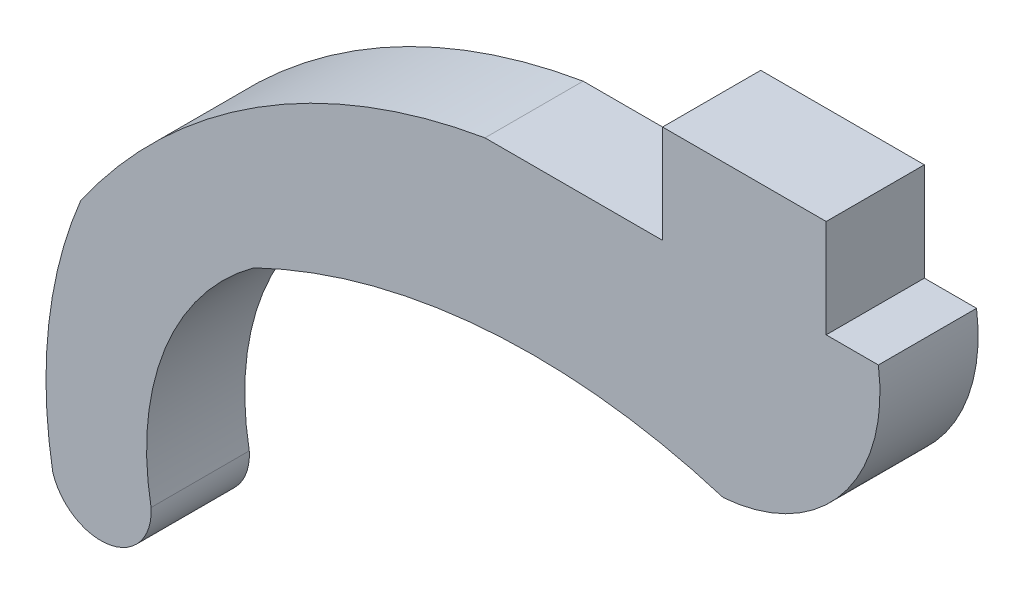
ISO-10303-21;
HEADER;
FILE_DESCRIPTION(('STEP AP214'),'2;1');
FILE_NAME('part.step','',(''),(''),'','','');
FILE_SCHEMA(('AUTOMOTIVE_DESIGN { 1 0 10303 214 1 1 1 1 }'));
ENDSEC;
DATA;
#1=APPLICATION_CONTEXT('core data for automotive mechanical design processes');
#2=APPLICATION_PROTOCOL_DEFINITION('international standard','automotive_design',2000,#1);
#3=PRODUCT_CONTEXT('',#1,'mechanical');
#4=PRODUCT('Part','Part','',(#3));
#5=PRODUCT_RELATED_PRODUCT_CATEGORY('part','',(#4));
#6=PRODUCT_DEFINITION_FORMATION('','',#4);
#7=PRODUCT_DEFINITION_CONTEXT('part definition',#1,'design');
#8=PRODUCT_DEFINITION('design','',#6,#7);
#9=PRODUCT_DEFINITION_SHAPE('','',#8);
#10=(LENGTH_UNIT() NAMED_UNIT(*) SI_UNIT(.MILLI.,.METRE.));
#11=(NAMED_UNIT(*) PLANE_ANGLE_UNIT() SI_UNIT($,.RADIAN.));
#12=(NAMED_UNIT(*) SI_UNIT($,.STERADIAN.) SOLID_ANGLE_UNIT());
#13=UNCERTAINTY_MEASURE_WITH_UNIT(LENGTH_MEASURE(1.E-05),#10,'distance_accuracy_value','');
#14=(GEOMETRIC_REPRESENTATION_CONTEXT(3) GLOBAL_UNCERTAINTY_ASSIGNED_CONTEXT((#13)) GLOBAL_UNIT_ASSIGNED_CONTEXT((#10,
#11,#12)) REPRESENTATION_CONTEXT('',''));
#15=CARTESIAN_POINT('',(0.,0.,0.));
#16=DIRECTION('',(0.,0.,1.));
#17=DIRECTION('',(1.,0.,0.));
#18=AXIS2_PLACEMENT_3D('',#15,#16,#17);
#19=CARTESIAN_POINT('',(-111.845658384387,0.,1.524));
#20=DIRECTION('',(0.,-1.,0.));
#21=DIRECTION('',(0.,0.,-1.));
#22=AXIS2_PLACEMENT_3D('',#19,#20,#21);
#23=PLANE('',#22);
#24=DIRECTION('',(-1.,0.,0.));
#25=VECTOR('',#24,1.);
#26=CARTESIAN_POINT('',(-111.845658384387,0.,0.));
#27=LINE('',#26,#25);
#28=CARTESIAN_POINT('',(-109.305658384387,0.,0.));
#29=VERTEX_POINT('',#28);
#30=CARTESIAN_POINT('',(-111.845658384387,0.,0.));
#31=VERTEX_POINT('',#30);
#32=EDGE_CURVE('E150',#29,#31,#27,.T.);
#33=ORIENTED_EDGE('',*,*,#32,.T.);
#34=DIRECTION('',(0.,0.,-1.));
#35=VECTOR('',#34,1.);
#36=CARTESIAN_POINT('',(-111.845658384387,0.,1.524));
#37=LINE('',#36,#35);
#38=CARTESIAN_POINT('',(-111.845658384387,0.,1.524));
#39=VERTEX_POINT('',#38);
#40=EDGE_CURVE('E11',#39,#31,#37,.T.);
#41=ORIENTED_EDGE('',*,*,#40,.F.);
#42=DIRECTION('',(-1.,0.,0.));
#43=VECTOR('',#42,1.);
#44=CARTESIAN_POINT('',(-111.845658384387,0.,1.524));
#45=LINE('',#44,#43);
#46=CARTESIAN_POINT('',(-109.305658384387,0.,1.524));
#47=VERTEX_POINT('',#46);
#48=EDGE_CURVE('E170',#47,#39,#45,.T.);
#49=ORIENTED_EDGE('',*,*,#48,.F.);
#50=DIRECTION('',(0.,0.,-1.));
#51=VECTOR('',#50,1.);
#52=CARTESIAN_POINT('',(-109.305658384387,0.,1.524));
#53=LINE('',#52,#51);
#54=EDGE_CURVE('E146',#47,#29,#53,.T.);
#55=ORIENTED_EDGE('',*,*,#54,.T.);
#56=EDGE_LOOP('',(#33,#41,#49,#55));
#57=FACE_BOUND('',#56,.T.);
#58=ADVANCED_FACE('F36',(#57),#23,.F.);
#59=CARTESIAN_POINT('',(-111.845658384387,0.,1.524));
#60=DIRECTION('',(1.,0.,0.));
#61=DIRECTION('',(0.,0.,-1.));
#62=AXIS2_PLACEMENT_3D('',#59,#60,#61);
#63=PLANE('',#62);
#64=DIRECTION('',(0.,-1.,0.));
#65=VECTOR('',#64,1.);
#66=CARTESIAN_POINT('',(-111.845658384387,0.,0.));
#67=LINE('',#66,#65);
#68=CARTESIAN_POINT('',(-111.845658384387,-1.524,0.));
#69=VERTEX_POINT('',#68);
#70=EDGE_CURVE('E153',#31,#69,#67,.T.);
#71=ORIENTED_EDGE('',*,*,#70,.T.);
#72=DIRECTION('',(0.,0.,-1.));
#73=VECTOR('',#72,1.);
#74=CARTESIAN_POINT('',(-111.845658384387,-1.524,1.524));
#75=LINE('',#74,#73);
#76=CARTESIAN_POINT('',(-111.845658384387,-1.524,1.524));
#77=VERTEX_POINT('',#76);
#78=EDGE_CURVE('E44',#77,#69,#75,.T.);
#79=ORIENTED_EDGE('',*,*,#78,.F.);
#80=DIRECTION('',(0.,-1.,0.));
#81=VECTOR('',#80,1.);
#82=CARTESIAN_POINT('',(-111.845658384387,0.,1.524));
#83=LINE('',#82,#81);
#84=EDGE_CURVE('E104',#39,#77,#83,.T.);
#85=ORIENTED_EDGE('',*,*,#84,.F.);
#86=ORIENTED_EDGE('',*,*,#40,.T.);
#87=EDGE_LOOP('',(#71,#79,#85,#86));
#88=FACE_BOUND('',#87,.T.);
#89=ADVANCED_FACE('F242',(#88),#63,.F.);
#90=CARTESIAN_POINT('',(-111.845658384387,-1.524,1.524));
#91=DIRECTION('',(0.,-1.,0.));
#92=DIRECTION('',(0.,0.,-1.));
#93=AXIS2_PLACEMENT_3D('',#90,#91,#92);
#94=PLANE('',#93);
#95=DIRECTION('',(-1.,0.,0.));
#96=VECTOR('',#95,1.);
#97=CARTESIAN_POINT('',(-111.845658384387,-1.524,0.));
#98=LINE('',#97,#96);
#99=CARTESIAN_POINT('',(-114.602460127081,-1.524,0.));
#100=VERTEX_POINT('',#99);
#101=EDGE_CURVE('E155',#69,#100,#98,.T.);
#102=ORIENTED_EDGE('',*,*,#101,.T.);
#103=DIRECTION('',(0.,0.,-1.));
#104=VECTOR('',#103,1.);
#105=CARTESIAN_POINT('',(-114.602460127081,-1.524,1.524));
#106=LINE('',#105,#104);
#107=CARTESIAN_POINT('',(-114.602460127081,-1.524,1.524));
#108=VERTEX_POINT('',#107);
#109=EDGE_CURVE('E186',#108,#100,#106,.T.);
#110=ORIENTED_EDGE('',*,*,#109,.F.);
#111=DIRECTION('',(-1.,0.,0.));
#112=VECTOR('',#111,1.);
#113=CARTESIAN_POINT('',(-111.845658384387,-1.524,1.524));
#114=LINE('',#113,#112);
#115=EDGE_CURVE('E194',#77,#108,#114,.T.);
#116=ORIENTED_EDGE('',*,*,#115,.F.);
#117=ORIENTED_EDGE('',*,*,#78,.T.);
#118=EDGE_LOOP('',(#102,#110,#116,#117));
#119=FACE_BOUND('',#118,.T.);
#120=ADVANCED_FACE('F192',(#119),#94,.F.);
#121=CARTESIAN_POINT('',(-112.996762013157,-10.990349581431,1.524));
#122=DIRECTION('',(0.,0.,-1.));
#123=DIRECTION('',(-1.,0.,0.));
#124=AXIS2_PLACEMENT_3D('',#121,#122,#123);
#125=CYLINDRICAL_SURFACE('',#124,9.60156449912805);
#126=CARTESIAN_POINT('',(-112.996762013157,-10.990349581431,0.));
#127=DIRECTION('',(0.,0.,1.));
#128=DIRECTION('',(1.,0.,0.));
#129=AXIS2_PLACEMENT_3D('',#126,#127,#128);
#130=CIRCLE('',#129,9.60156449912805);
#131=CARTESIAN_POINT('',(-120.878346421559,-5.50667672064264,0.));
#132=VERTEX_POINT('',#131);
#133=EDGE_CURVE('E157',#100,#132,#130,.T.);
#134=ORIENTED_EDGE('',*,*,#133,.T.);
#135=DIRECTION('',(0.,0.,-1.));
#136=VECTOR('',#135,1.);
#137=CARTESIAN_POINT('',(-120.878346421559,-5.50667672064264,1.524));
#138=LINE('',#137,#136);
#139=CARTESIAN_POINT('',(-120.878346421559,-5.50667672064264,1.524));
#140=VERTEX_POINT('',#139);
#141=EDGE_CURVE('E183',#140,#132,#138,.T.);
#142=ORIENTED_EDGE('',*,*,#141,.F.);
#143=CARTESIAN_POINT('',(-112.996762013157,-10.990349581431,1.524));
#144=DIRECTION('',(0.,0.,1.));
#145=DIRECTION('',(1.,0.,0.));
#146=AXIS2_PLACEMENT_3D('',#143,#144,#145);
#147=CIRCLE('',#146,9.60156449912805);
#148=EDGE_CURVE('E212',#108,#140,#147,.T.);
#149=ORIENTED_EDGE('',*,*,#148,.F.);
#150=ORIENTED_EDGE('',*,*,#109,.T.);
#151=EDGE_LOOP('',(#134,#142,#149,#150));
#152=FACE_BOUND('',#151,.T.);
#153=ADVANCED_FACE('F203',(#152),#125,.T.);
#154=CARTESIAN_POINT('',(-114.523744723031,-8.17618633381467,1.524));
#155=DIRECTION('',(0.,0.,-1.));
#156=DIRECTION('',(-1.,0.,0.));
#157=AXIS2_PLACEMENT_3D('',#154,#155,#156);
#158=CYLINDRICAL_SURFACE('',#157,6.89254991434649);
#159=CARTESIAN_POINT('',(-114.523744723031,-8.17618633381467,0.));
#160=DIRECTION('',(0.,0.,1.));
#161=DIRECTION('',(1.,0.,0.));
#162=AXIS2_PLACEMENT_3D('',#159,#160,#161);
#163=CIRCLE('',#162,6.89254991434649);
#164=CARTESIAN_POINT('',(-121.311747708148,-9.37212102926943,0.));
#165=VERTEX_POINT('',#164);
#166=EDGE_CURVE('E159',#132,#165,#163,.T.);
#167=ORIENTED_EDGE('',*,*,#166,.T.);
#168=DIRECTION('',(0.,0.,-1.));
#169=VECTOR('',#168,1.);
#170=CARTESIAN_POINT('',(-121.311747708148,-9.37212102926943,1.524));
#171=LINE('',#170,#169);
#172=CARTESIAN_POINT('',(-121.311747708148,-9.37212102926943,1.524));
#173=VERTEX_POINT('',#172);
#174=EDGE_CURVE('E180',#173,#165,#171,.T.);
#175=ORIENTED_EDGE('',*,*,#174,.F.);
#176=CARTESIAN_POINT('',(-114.523744723031,-8.17618633381467,1.524));
#177=DIRECTION('',(0.,0.,1.));
#178=DIRECTION('',(1.,0.,0.));
#179=AXIS2_PLACEMENT_3D('',#176,#177,#178);
#180=CIRCLE('',#179,6.89254991434649);
#181=EDGE_CURVE('E209',#140,#173,#180,.T.);
#182=ORIENTED_EDGE('',*,*,#181,.F.);
#183=ORIENTED_EDGE('',*,*,#141,.T.);
#184=EDGE_LOOP('',(#167,#175,#182,#183));
#185=FACE_BOUND('',#184,.T.);
#186=ADVANCED_FACE('F207',(#185),#158,.T.);
#187=CARTESIAN_POINT('',(-120.565381788024,-9.13873196802296,1.524));
#188=DIRECTION('',(0.,0.,-1.));
#189=DIRECTION('',(-1.,0.,0.));
#190=AXIS2_PLACEMENT_3D('',#187,#188,#189);
#191=CYLINDRICAL_SURFACE('',#190,0.782005460743449);
#192=CARTESIAN_POINT('',(-120.565381788024,-9.13873196802296,0.));
#193=DIRECTION('',(0.,0.,1.));
#194=DIRECTION('',(-1.,0.,0.));
#195=AXIS2_PLACEMENT_3D('',#192,#193,#194);
#196=CIRCLE('',#195,0.782005460743449);
#197=CARTESIAN_POINT('',(-119.785228435081,-9.08494268912818,0.));
#198=VERTEX_POINT('',#197);
#199=EDGE_CURVE('E161',#165,#198,#196,.T.);
#200=ORIENTED_EDGE('',*,*,#199,.T.);
#201=DIRECTION('',(0.,0.,-1.));
#202=VECTOR('',#201,1.);
#203=CARTESIAN_POINT('',(-119.785228435081,-9.08494268912818,1.524));
#204=LINE('',#203,#202);
#205=CARTESIAN_POINT('',(-119.785228435081,-9.08494268912818,1.524));
#206=VERTEX_POINT('',#205);
#207=EDGE_CURVE('E177',#206,#198,#204,.T.);
#208=ORIENTED_EDGE('',*,*,#207,.F.);
#209=CARTESIAN_POINT('',(-120.565381788024,-9.13873196802296,1.524));
#210=DIRECTION('',(0.,0.,1.));
#211=DIRECTION('',(-1.,0.,0.));
#212=AXIS2_PLACEMENT_3D('',#209,#210,#211);
#213=CIRCLE('',#212,0.782005460743449);
#214=EDGE_CURVE('E211',#173,#206,#213,.T.);
#215=ORIENTED_EDGE('',*,*,#214,.F.);
#216=ORIENTED_EDGE('',*,*,#174,.T.);
#217=EDGE_LOOP('',(#200,#208,#215,#216));
#218=FACE_BOUND('',#217,.T.);
#219=ADVANCED_FACE('F255',(#218),#191,.T.);
#220=CARTESIAN_POINT('',(-115.806880780708,-8.33651108001276,1.524));
#221=DIRECTION('',(0.,0.,-1.));
#222=DIRECTION('',(-1.,0.,0.));
#223=AXIS2_PLACEMENT_3D('',#220,#221,#222);
#224=CYLINDRICAL_SURFACE('',#223,4.04813536490303);
#225=CARTESIAN_POINT('',(-115.806880780708,-8.33651108001276,0.));
#226=DIRECTION('',(0.,0.,-1.));
#227=DIRECTION('',(1.,0.,0.));
#228=AXIS2_PLACEMENT_3D('',#225,#226,#227);
#229=CIRCLE('',#228,4.04813536490303);
#230=CARTESIAN_POINT('',(-118.193770427078,-5.06693041139041,0.));
#231=VERTEX_POINT('',#230);
#232=EDGE_CURVE('E163',#198,#231,#229,.T.);
#233=ORIENTED_EDGE('',*,*,#232,.T.);
#234=DIRECTION('',(0.,0.,-1.));
#235=VECTOR('',#234,1.);
#236=CARTESIAN_POINT('',(-118.193770427078,-5.06693041139041,1.524));
#237=LINE('',#236,#235);
#238=CARTESIAN_POINT('',(-118.193770427078,-5.06693041139041,1.524));
#239=VERTEX_POINT('',#238);
#240=EDGE_CURVE('E174',#239,#231,#237,.T.);
#241=ORIENTED_EDGE('',*,*,#240,.F.);
#242=CARTESIAN_POINT('',(-115.806880780708,-8.33651108001276,1.524));
#243=DIRECTION('',(0.,0.,-1.));
#244=DIRECTION('',(1.,0.,0.));
#245=AXIS2_PLACEMENT_3D('',#242,#243,#244);
#246=CIRCLE('',#245,4.04813536490303);
#247=EDGE_CURVE('E214',#206,#239,#246,.T.);
#248=ORIENTED_EDGE('',*,*,#247,.F.);
#249=ORIENTED_EDGE('',*,*,#207,.T.);
#250=EDGE_LOOP('',(#233,#241,#248,#249));
#251=FACE_BOUND('',#250,.T.);
#252=ADVANCED_FACE('F223',(#251),#224,.F.);
#253=CARTESIAN_POINT('',(-113.844867219783,-14.027213762315,1.524));
#254=DIRECTION('',(0.,0.,-1.));
#255=DIRECTION('',(-1.,0.,0.));
#256=AXIS2_PLACEMENT_3D('',#253,#254,#255);
#257=CYLINDRICAL_SURFACE('',#256,9.95990144706653);
#258=CARTESIAN_POINT('',(-113.844867219783,-14.027213762315,0.));
#259=DIRECTION('',(0.,0.,-1.));
#260=DIRECTION('',(1.,0.,0.));
#261=AXIS2_PLACEMENT_3D('',#258,#259,#260);
#262=CIRCLE('',#261,9.95990144706653);
#263=CARTESIAN_POINT('',(-110.905453840669,-4.51093897530086,0.));
#264=VERTEX_POINT('',#263);
#265=EDGE_CURVE('E165',#231,#264,#262,.T.);
#266=ORIENTED_EDGE('',*,*,#265,.T.);
#267=DIRECTION('',(0.,0.,-1.));
#268=VECTOR('',#267,1.);
#269=CARTESIAN_POINT('',(-110.905453840669,-4.51093897530086,1.524));
#270=LINE('',#269,#268);
#271=CARTESIAN_POINT('',(-110.905453840669,-4.51093897530086,1.524));
#272=VERTEX_POINT('',#271);
#273=EDGE_CURVE('E141',#272,#264,#270,.T.);
#274=ORIENTED_EDGE('',*,*,#273,.F.);
#275=CARTESIAN_POINT('',(-113.844867219783,-14.027213762315,1.524));
#276=DIRECTION('',(0.,0.,-1.));
#277=DIRECTION('',(1.,0.,0.));
#278=AXIS2_PLACEMENT_3D('',#275,#276,#277);
#279=CIRCLE('',#278,9.95990144706653);
#280=EDGE_CURVE('E132',#239,#272,#279,.T.);
#281=ORIENTED_EDGE('',*,*,#280,.F.);
#282=ORIENTED_EDGE('',*,*,#240,.T.);
#283=EDGE_LOOP('',(#266,#274,#281,#282));
#284=FACE_BOUND('',#283,.T.);
#285=ADVANCED_FACE('F227',(#284),#257,.F.);
#286=CARTESIAN_POINT('',(-111.105880361588,-1.88361085124618,1.524));
#287=DIRECTION('',(0.,0.,-1.));
#288=DIRECTION('',(-1.,0.,0.));
#289=AXIS2_PLACEMENT_3D('',#286,#287,#288);
#290=CYLINDRICAL_SURFACE('',#289,2.63496183307016);
#291=CARTESIAN_POINT('',(-111.105880361588,-1.88361085124618,0.));
#292=DIRECTION('',(0.,0.,1.));
#293=DIRECTION('',(-1.,0.,0.));
#294=AXIS2_PLACEMENT_3D('',#291,#292,#293);
#295=CIRCLE('',#294,2.63496183307016);
#296=CARTESIAN_POINT('',(-108.495573119633,-1.524,0.));
#297=VERTEX_POINT('',#296);
#298=EDGE_CURVE('E140',#264,#297,#295,.T.);
#299=ORIENTED_EDGE('',*,*,#298,.T.);
#300=DIRECTION('',(0.,0.,-1.));
#301=VECTOR('',#300,1.);
#302=CARTESIAN_POINT('',(-108.495573119633,-1.524,1.524));
#303=LINE('',#302,#301);
#304=CARTESIAN_POINT('',(-108.495573119633,-1.524,1.524));
#305=VERTEX_POINT('',#304);
#306=EDGE_CURVE('E137',#305,#297,#303,.T.);
#307=ORIENTED_EDGE('',*,*,#306,.F.);
#308=CARTESIAN_POINT('',(-111.105880361588,-1.88361085124618,1.524));
#309=DIRECTION('',(0.,0.,1.));
#310=DIRECTION('',(-1.,0.,0.));
#311=AXIS2_PLACEMENT_3D('',#308,#309,#310);
#312=CIRCLE('',#311,2.63496183307016);
#313=EDGE_CURVE('E126',#272,#305,#312,.T.);
#314=ORIENTED_EDGE('',*,*,#313,.F.);
#315=ORIENTED_EDGE('',*,*,#273,.T.);
#316=EDGE_LOOP('',(#299,#307,#314,#315));
#317=FACE_BOUND('',#316,.T.);
#318=ADVANCED_FACE('F138',(#317),#290,.T.);
#319=CARTESIAN_POINT('',(-109.305658384387,-1.524,1.524));
#320=DIRECTION('',(0.,-1.,0.));
#321=DIRECTION('',(0.,0.,-1.));
#322=AXIS2_PLACEMENT_3D('',#319,#320,#321);
#323=PLANE('',#322);
#324=DIRECTION('',(-1.,0.,0.));
#325=VECTOR('',#324,1.);
#326=CARTESIAN_POINT('',(-109.305658384387,-1.524,0.));
#327=LINE('',#326,#325);
#328=CARTESIAN_POINT('',(-109.305658384387,-1.524,0.));
#329=VERTEX_POINT('',#328);
#330=EDGE_CURVE('E90',#297,#329,#327,.T.);
#331=ORIENTED_EDGE('',*,*,#330,.T.);
#332=DIRECTION('',(0.,0.,-1.));
#333=VECTOR('',#332,1.);
#334=CARTESIAN_POINT('',(-109.305658384387,-1.524,1.524));
#335=LINE('',#334,#333);
#336=CARTESIAN_POINT('',(-109.305658384387,-1.524,1.524));
#337=VERTEX_POINT('',#336);
#338=EDGE_CURVE('E142',#337,#329,#335,.T.);
#339=ORIENTED_EDGE('',*,*,#338,.F.);
#340=DIRECTION('',(-1.,0.,0.));
#341=VECTOR('',#340,1.);
#342=CARTESIAN_POINT('',(-109.305658384387,-1.524,1.524));
#343=LINE('',#342,#341);
#344=EDGE_CURVE('E130',#305,#337,#343,.T.);
#345=ORIENTED_EDGE('',*,*,#344,.F.);
#346=ORIENTED_EDGE('',*,*,#306,.T.);
#347=EDGE_LOOP('',(#331,#339,#345,#346));
#348=FACE_BOUND('',#347,.T.);
#349=ADVANCED_FACE('F144',(#348),#323,.F.);
#350=CARTESIAN_POINT('',(-109.305658384387,0.,1.524));
#351=DIRECTION('',(-1.,0.,0.));
#352=DIRECTION('',(0.,0.,1.));
#353=AXIS2_PLACEMENT_3D('',#350,#351,#352);
#354=PLANE('',#353);
#355=DIRECTION('',(0.,1.,0.));
#356=VECTOR('',#355,1.);
#357=CARTESIAN_POINT('',(-109.305658384387,0.,0.));
#358=LINE('',#357,#356);
#359=EDGE_CURVE('E96',#329,#29,#358,.T.);
#360=ORIENTED_EDGE('',*,*,#359,.T.);
#361=ORIENTED_EDGE('',*,*,#54,.F.);
#362=DIRECTION('',(0.,1.,0.));
#363=VECTOR('',#362,1.);
#364=CARTESIAN_POINT('',(-109.305658384387,0.,1.524));
#365=LINE('',#364,#363);
#366=EDGE_CURVE('E52',#337,#47,#365,.T.);
#367=ORIENTED_EDGE('',*,*,#366,.F.);
#368=ORIENTED_EDGE('',*,*,#338,.T.);
#369=EDGE_LOOP('',(#360,#361,#367,#368));
#370=FACE_BOUND('',#369,.T.);
#371=ADVANCED_FACE('F231',(#370),#354,.F.);
#372=CARTESIAN_POINT('',(-111.105880361588,-1.88361085124618,1.524));
#373=DIRECTION('',(0.,0.,-1.));
#374=DIRECTION('',(-1.,0.,0.));
#375=AXIS2_PLACEMENT_3D('',#372,#373,#374);
#376=PLANE('',#375);
#377=ORIENTED_EDGE('',*,*,#48,.T.);
#378=ORIENTED_EDGE('',*,*,#84,.T.);
#379=ORIENTED_EDGE('',*,*,#115,.T.);
#380=ORIENTED_EDGE('',*,*,#148,.T.);
#381=ORIENTED_EDGE('',*,*,#181,.T.);
#382=ORIENTED_EDGE('',*,*,#214,.T.);
#383=ORIENTED_EDGE('',*,*,#247,.T.);
#384=ORIENTED_EDGE('',*,*,#280,.T.);
#385=ORIENTED_EDGE('',*,*,#313,.T.);
#386=ORIENTED_EDGE('',*,*,#344,.T.);
#387=ORIENTED_EDGE('',*,*,#366,.T.);
#388=EDGE_LOOP('',(#377,#378,#379,#380,#381,#382,#383,#384,#385,#386,#387));
#389=FACE_BOUND('',#388,.T.);
#390=ADVANCED_FACE('F128',(#389),#376,.F.);
#391=CARTESIAN_POINT('',(-111.105880361588,-1.88361085124618,0.));
#392=DIRECTION('',(0.,0.,-1.));
#393=DIRECTION('',(-1.,0.,0.));
#394=AXIS2_PLACEMENT_3D('',#391,#392,#393);
#395=PLANE('',#394);
#396=ORIENTED_EDGE('',*,*,#32,.F.);
#397=ORIENTED_EDGE('',*,*,#359,.F.);
#398=ORIENTED_EDGE('',*,*,#330,.F.);
#399=ORIENTED_EDGE('',*,*,#298,.F.);
#400=ORIENTED_EDGE('',*,*,#265,.F.);
#401=ORIENTED_EDGE('',*,*,#232,.F.);
#402=ORIENTED_EDGE('',*,*,#199,.F.);
#403=ORIENTED_EDGE('',*,*,#166,.F.);
#404=ORIENTED_EDGE('',*,*,#133,.F.);
#405=ORIENTED_EDGE('',*,*,#101,.F.);
#406=ORIENTED_EDGE('',*,*,#70,.F.);
#407=EDGE_LOOP('',(#396,#397,#398,#399,#400,#401,#402,#403,#404,#405,#406));
#408=FACE_BOUND('',#407,.T.);
#409=ADVANCED_FACE('F198',(#408),#395,.T.);
#410=CLOSED_SHELL('',(#58,#89,#120,#153,#186,#219,#252,#285,#318,#349,#371,#390,#409));
#411=MANIFOLD_SOLID_BREP('B2',#410);
#412=ADVANCED_BREP_SHAPE_REPRESENTATION('',(#18,#411),#14);
#413=SHAPE_DEFINITION_REPRESENTATION(#9,#412);
ENDSEC;
END-ISO-10303-21;
